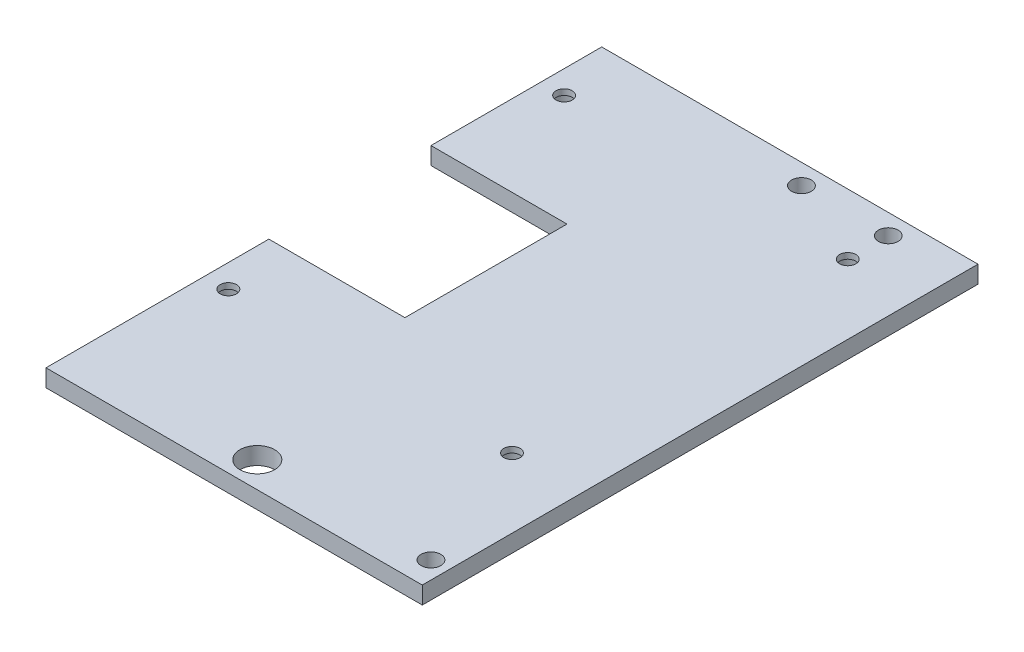
ISO-10303-21;
HEADER;
FILE_DESCRIPTION(('STEP AP214'),'2;1');
FILE_NAME('part.step','',(''),(''),'','','');
FILE_SCHEMA(('AUTOMOTIVE_DESIGN { 1 0 10303 214 1 1 1 1 }'));
ENDSEC;
DATA;
#1=APPLICATION_CONTEXT('core data for automotive mechanical design processes');
#2=APPLICATION_PROTOCOL_DEFINITION('international standard','automotive_design',2000,#1);
#3=PRODUCT_CONTEXT('',#1,'mechanical');
#4=PRODUCT('Part','Part','',(#3));
#5=PRODUCT_RELATED_PRODUCT_CATEGORY('part','',(#4));
#6=PRODUCT_DEFINITION_FORMATION('','',#4);
#7=PRODUCT_DEFINITION_CONTEXT('part definition',#1,'design');
#8=PRODUCT_DEFINITION('design','',#6,#7);
#9=PRODUCT_DEFINITION_SHAPE('','',#8);
#10=(LENGTH_UNIT() NAMED_UNIT(*) SI_UNIT(.MILLI.,.METRE.));
#11=(NAMED_UNIT(*) PLANE_ANGLE_UNIT() SI_UNIT($,.RADIAN.));
#12=(NAMED_UNIT(*) SI_UNIT($,.STERADIAN.) SOLID_ANGLE_UNIT());
#13=UNCERTAINTY_MEASURE_WITH_UNIT(LENGTH_MEASURE(1.E-05),#10,'distance_accuracy_value','');
#14=(GEOMETRIC_REPRESENTATION_CONTEXT(3) GLOBAL_UNCERTAINTY_ASSIGNED_CONTEXT((#13)) GLOBAL_UNIT_ASSIGNED_CONTEXT((#10,
#11,#12)) REPRESENTATION_CONTEXT('',''));
#15=CARTESIAN_POINT('',(0.,0.,0.));
#16=DIRECTION('',(0.,0.,1.));
#17=DIRECTION('',(1.,0.,0.));
#18=AXIS2_PLACEMENT_3D('',#15,#16,#17);
#19=CARTESIAN_POINT('',(7.49999999999999,3.,-37.5));
#20=DIRECTION('',(0.,-1.,0.));
#21=DIRECTION('',(0.,0.,-1.));
#22=AXIS2_PLACEMENT_3D('',#19,#20,#21);
#23=CYLINDRICAL_SURFACE('',#22,1.4);
#24=CARTESIAN_POINT('',(7.49999999999999,2.,-37.5));
#25=DIRECTION('',(0.,1.,0.));
#26=DIRECTION('',(0.,0.,1.));
#27=AXIS2_PLACEMENT_3D('',#24,#25,#26);
#28=CIRCLE('',#27,1.4);
#29=CARTESIAN_POINT('',(7.49999999999999,2.,-36.1));
#30=VERTEX_POINT('',#29);
#31=EDGE_CURVE('E299',#30,#30,#28,.T.);
#32=ORIENTED_EDGE('',*,*,#31,.F.);
#33=EDGE_LOOP('',(#32));
#34=FACE_BOUND('',#33,.T.);
#35=CARTESIAN_POINT('',(7.49999999999999,3.,-37.5));
#36=DIRECTION('',(0.,1.,0.));
#37=DIRECTION('',(0.,0.,1.));
#38=AXIS2_PLACEMENT_3D('',#35,#36,#37);
#39=CIRCLE('',#38,1.4);
#40=CARTESIAN_POINT('',(7.49999999999999,3.,-36.1));
#41=VERTEX_POINT('',#40);
#42=EDGE_CURVE('E211',#41,#41,#39,.T.);
#43=ORIENTED_EDGE('',*,*,#42,.T.);
#44=EDGE_LOOP('',(#43));
#45=FACE_BOUND('',#44,.T.);
#46=ADVANCED_FACE('F95',(#34,#45),#23,.F.);
#47=CARTESIAN_POINT('',(16.5,3.,43.5));
#48=DIRECTION('',(0.,-1.,0.));
#49=DIRECTION('',(0.,0.,-1.));
#50=AXIS2_PLACEMENT_3D('',#47,#48,#49);
#51=CYLINDRICAL_SURFACE('',#50,1.7);
#52=CARTESIAN_POINT('',(16.5,3.,43.5));
#53=DIRECTION('',(0.,1.,0.));
#54=DIRECTION('',(0.,0.,1.));
#55=AXIS2_PLACEMENT_3D('',#52,#53,#54);
#56=CIRCLE('',#55,1.7);
#57=CARTESIAN_POINT('',(16.5,3.,45.2));
#58=VERTEX_POINT('',#57);
#59=EDGE_CURVE('E208',#58,#58,#56,.T.);
#60=ORIENTED_EDGE('',*,*,#59,.T.);
#61=EDGE_LOOP('',(#60));
#62=FACE_BOUND('',#61,.T.);
#63=CARTESIAN_POINT('',(16.5,0.,43.5));
#64=DIRECTION('',(0.,1.,0.));
#65=DIRECTION('',(0.,0.,1.));
#66=AXIS2_PLACEMENT_3D('',#63,#64,#65);
#67=CIRCLE('',#66,1.7);
#68=CARTESIAN_POINT('',(16.5,0.,45.2));
#69=VERTEX_POINT('',#68);
#70=EDGE_CURVE('E239',#69,#69,#67,.T.);
#71=ORIENTED_EDGE('',*,*,#70,.F.);
#72=EDGE_LOOP('',(#71));
#73=FACE_BOUND('',#72,.T.);
#74=ADVANCED_FACE('F333',(#62,#73),#51,.F.);
#75=CARTESIAN_POINT('',(7.49999999999999,3.,-44.5));
#76=DIRECTION('',(0.,-1.,0.));
#77=DIRECTION('',(0.,0.,-1.));
#78=AXIS2_PLACEMENT_3D('',#75,#76,#77);
#79=CYLINDRICAL_SURFACE('',#78,1.70000000000001);
#80=CARTESIAN_POINT('',(7.49999999999999,3.,-44.5));
#81=DIRECTION('',(0.,1.,0.));
#82=DIRECTION('',(0.,0.,1.));
#83=AXIS2_PLACEMENT_3D('',#80,#81,#82);
#84=CIRCLE('',#83,1.70000000000001);
#85=CARTESIAN_POINT('',(7.49999999999999,3.,-42.8));
#86=VERTEX_POINT('',#85);
#87=EDGE_CURVE('E205',#86,#86,#84,.T.);
#88=ORIENTED_EDGE('',*,*,#87,.T.);
#89=EDGE_LOOP('',(#88));
#90=FACE_BOUND('',#89,.T.);
#91=CARTESIAN_POINT('',(7.49999999999999,0.,-44.5));
#92=DIRECTION('',(0.,1.,0.));
#93=DIRECTION('',(0.,0.,1.));
#94=AXIS2_PLACEMENT_3D('',#91,#92,#93);
#95=CIRCLE('',#94,1.70000000000001);
#96=CARTESIAN_POINT('',(7.49999999999999,0.,-42.8));
#97=VERTEX_POINT('',#96);
#98=EDGE_CURVE('E236',#97,#97,#95,.T.);
#99=ORIENTED_EDGE('',*,*,#98,.F.);
#100=EDGE_LOOP('',(#99));
#101=FACE_BOUND('',#100,.T.);
#102=ADVANCED_FACE('F339',(#90,#101),#79,.F.);
#103=CARTESIAN_POINT('',(-41.5,3.,-37.5));
#104=DIRECTION('',(0.,-1.,0.));
#105=DIRECTION('',(0.,0.,-1.));
#106=AXIS2_PLACEMENT_3D('',#103,#104,#105);
#107=CYLINDRICAL_SURFACE('',#106,1.4);
#108=CARTESIAN_POINT('',(-41.5,2.,-37.5));
#109=DIRECTION('',(0.,1.,0.));
#110=DIRECTION('',(0.,0.,1.));
#111=AXIS2_PLACEMENT_3D('',#108,#109,#110);
#112=CIRCLE('',#111,1.4);
#113=CARTESIAN_POINT('',(-41.5,2.,-36.1));
#114=VERTEX_POINT('',#113);
#115=EDGE_CURVE('E290',#114,#114,#112,.T.);
#116=ORIENTED_EDGE('',*,*,#115,.F.);
#117=EDGE_LOOP('',(#116));
#118=FACE_BOUND('',#117,.T.);
#119=CARTESIAN_POINT('',(-41.5,3.,-37.5));
#120=DIRECTION('',(0.,1.,0.));
#121=DIRECTION('',(0.,0.,1.));
#122=AXIS2_PLACEMENT_3D('',#119,#120,#121);
#123=CIRCLE('',#122,1.4);
#124=CARTESIAN_POINT('',(-41.5,3.,-36.1));
#125=VERTEX_POINT('',#124);
#126=EDGE_CURVE('E202',#125,#125,#123,.T.);
#127=ORIENTED_EDGE('',*,*,#126,.T.);
#128=EDGE_LOOP('',(#127));
#129=FACE_BOUND('',#128,.T.);
#130=ADVANCED_FACE('F347',(#118,#129),#107,.F.);
#131=CARTESIAN_POINT('',(-41.5,3.,20.5));
#132=DIRECTION('',(0.,-1.,0.));
#133=DIRECTION('',(0.,0.,-1.));
#134=AXIS2_PLACEMENT_3D('',#131,#132,#133);
#135=CYLINDRICAL_SURFACE('',#134,1.4);
#136=CARTESIAN_POINT('',(-41.5,2.,20.5));
#137=DIRECTION('',(0.,1.,0.));
#138=DIRECTION('',(0.,0.,1.));
#139=AXIS2_PLACEMENT_3D('',#136,#137,#138);
#140=CIRCLE('',#139,1.4);
#141=CARTESIAN_POINT('',(-41.5,2.,21.9));
#142=VERTEX_POINT('',#141);
#143=EDGE_CURVE('E280',#142,#142,#140,.T.);
#144=ORIENTED_EDGE('',*,*,#143,.F.);
#145=EDGE_LOOP('',(#144));
#146=FACE_BOUND('',#145,.T.);
#147=CARTESIAN_POINT('',(-41.5,3.,20.5));
#148=DIRECTION('',(0.,1.,0.));
#149=DIRECTION('',(0.,0.,1.));
#150=AXIS2_PLACEMENT_3D('',#147,#148,#149);
#151=CIRCLE('',#150,1.4);
#152=CARTESIAN_POINT('',(-41.5,3.,21.9));
#153=VERTEX_POINT('',#152);
#154=EDGE_CURVE('E199',#153,#153,#151,.T.);
#155=ORIENTED_EDGE('',*,*,#154,.T.);
#156=EDGE_LOOP('',(#155));
#157=FACE_BOUND('',#156,.T.);
#158=ADVANCED_FACE('F351',(#146,#157),#135,.F.);
#159=CARTESIAN_POINT('',(-7.50000000000001,3.,-44.5));
#160=DIRECTION('',(0.,-1.,0.));
#161=DIRECTION('',(0.,0.,-1.));
#162=AXIS2_PLACEMENT_3D('',#159,#160,#161);
#163=CYLINDRICAL_SURFACE('',#162,1.70000000000001);
#164=CARTESIAN_POINT('',(-7.50000000000001,3.,-44.5));
#165=DIRECTION('',(0.,1.,0.));
#166=DIRECTION('',(0.,0.,1.));
#167=AXIS2_PLACEMENT_3D('',#164,#165,#166);
#168=CIRCLE('',#167,1.70000000000001);
#169=CARTESIAN_POINT('',(-7.50000000000001,3.,-42.8));
#170=VERTEX_POINT('',#169);
#171=EDGE_CURVE('E196',#170,#170,#168,.T.);
#172=ORIENTED_EDGE('',*,*,#171,.T.);
#173=EDGE_LOOP('',(#172));
#174=FACE_BOUND('',#173,.T.);
#175=CARTESIAN_POINT('',(-7.50000000000001,0.,-44.5));
#176=DIRECTION('',(0.,1.,0.));
#177=DIRECTION('',(0.,0.,1.));
#178=AXIS2_PLACEMENT_3D('',#175,#176,#177);
#179=CIRCLE('',#178,1.70000000000001);
#180=CARTESIAN_POINT('',(-7.50000000000001,0.,-42.8));
#181=VERTEX_POINT('',#180);
#182=EDGE_CURVE('E233',#181,#181,#179,.T.);
#183=ORIENTED_EDGE('',*,*,#182,.F.);
#184=EDGE_LOOP('',(#183));
#185=FACE_BOUND('',#184,.T.);
#186=ADVANCED_FACE('F355',(#174,#185),#163,.F.);
#187=CARTESIAN_POINT('',(-13.5,3.,43.5));
#188=DIRECTION('',(0.,-1.,0.));
#189=DIRECTION('',(0.,0.,-1.));
#190=AXIS2_PLACEMENT_3D('',#187,#188,#189);
#191=CYLINDRICAL_SURFACE('',#190,3.);
#192=CARTESIAN_POINT('',(-13.5,3.,43.5));
#193=DIRECTION('',(0.,1.,0.));
#194=DIRECTION('',(0.,0.,1.));
#195=AXIS2_PLACEMENT_3D('',#192,#193,#194);
#196=CIRCLE('',#195,3.);
#197=CARTESIAN_POINT('',(-13.5,3.,46.5));
#198=VERTEX_POINT('',#197);
#199=EDGE_CURVE('E189',#198,#198,#196,.T.);
#200=ORIENTED_EDGE('',*,*,#199,.T.);
#201=EDGE_LOOP('',(#200));
#202=FACE_BOUND('',#201,.T.);
#203=CARTESIAN_POINT('',(-13.5,0.,43.5));
#204=DIRECTION('',(0.,1.,0.));
#205=DIRECTION('',(0.,0.,1.));
#206=AXIS2_PLACEMENT_3D('',#203,#204,#205);
#207=CIRCLE('',#206,3.);
#208=CARTESIAN_POINT('',(-13.5,0.,46.5));
#209=VERTEX_POINT('',#208);
#210=EDGE_CURVE('E230',#209,#209,#207,.T.);
#211=ORIENTED_EDGE('',*,*,#210,.F.);
#212=EDGE_LOOP('',(#211));
#213=FACE_BOUND('',#212,.T.);
#214=ADVANCED_FACE('F359',(#202,#213),#191,.F.);
#215=CARTESIAN_POINT('',(19.5,3.,0.));
#216=DIRECTION('',(1.,0.,0.));
#217=DIRECTION('',(0.,0.,-1.));
#218=AXIS2_PLACEMENT_3D('',#215,#216,#217);
#219=PLANE('',#218);
#220=DIRECTION('',(0.,0.,1.));
#221=VECTOR('',#220,1.);
#222=CARTESIAN_POINT('',(19.5,0.,0.));
#223=LINE('',#222,#221);
#224=CARTESIAN_POINT('',(19.5,0.,-48.));
#225=VERTEX_POINT('',#224);
#226=CARTESIAN_POINT('',(19.5,0.,48.));
#227=VERTEX_POINT('',#226);
#228=EDGE_CURVE('E218',#225,#227,#223,.T.);
#229=ORIENTED_EDGE('',*,*,#228,.F.);
#230=DIRECTION('',(0.,-1.,0.));
#231=VECTOR('',#230,1.);
#232=CARTESIAN_POINT('',(19.5,3.,-48.));
#233=LINE('',#232,#231);
#234=CARTESIAN_POINT('',(19.5,3.,-48.));
#235=VERTEX_POINT('',#234);
#236=EDGE_CURVE('E105',#235,#225,#233,.T.);
#237=ORIENTED_EDGE('',*,*,#236,.F.);
#238=DIRECTION('',(0.,0.,1.));
#239=VECTOR('',#238,1.);
#240=CARTESIAN_POINT('',(19.5,3.,0.));
#241=LINE('',#240,#239);
#242=CARTESIAN_POINT('',(19.5,3.,48.));
#243=VERTEX_POINT('',#242);
#244=EDGE_CURVE('E274',#235,#243,#241,.T.);
#245=ORIENTED_EDGE('',*,*,#244,.T.);
#246=DIRECTION('',(0.,-1.,0.));
#247=VECTOR('',#246,1.);
#248=CARTESIAN_POINT('',(19.5,3.,48.));
#249=LINE('',#248,#247);
#250=EDGE_CURVE('E12',#243,#227,#249,.T.);
#251=ORIENTED_EDGE('',*,*,#250,.T.);
#252=EDGE_LOOP('',(#229,#237,#245,#251));
#253=FACE_BOUND('',#252,.T.);
#254=ADVANCED_FACE('F259',(#253),#219,.T.);
#255=CARTESIAN_POINT('',(0.,3.,-48.));
#256=DIRECTION('',(0.,0.,-1.));
#257=DIRECTION('',(-1.,0.,0.));
#258=AXIS2_PLACEMENT_3D('',#255,#256,#257);
#259=PLANE('',#258);
#260=DIRECTION('',(1.,0.,0.));
#261=VECTOR('',#260,1.);
#262=CARTESIAN_POINT('',(0.,0.,-48.));
#263=LINE('',#262,#261);
#264=CARTESIAN_POINT('',(-45.5,0.,-48.));
#265=VERTEX_POINT('',#264);
#266=EDGE_CURVE('E221',#265,#225,#263,.T.);
#267=ORIENTED_EDGE('',*,*,#266,.F.);
#268=DIRECTION('',(0.,-1.,0.));
#269=VECTOR('',#268,1.);
#270=CARTESIAN_POINT('',(-45.5,3.,-48.));
#271=LINE('',#270,#269);
#272=CARTESIAN_POINT('',(-45.5,3.,-48.));
#273=VERTEX_POINT('',#272);
#274=EDGE_CURVE('E248',#273,#265,#271,.T.);
#275=ORIENTED_EDGE('',*,*,#274,.F.);
#276=DIRECTION('',(1.,0.,0.));
#277=VECTOR('',#276,1.);
#278=CARTESIAN_POINT('',(0.,3.,-48.));
#279=LINE('',#278,#277);
#280=EDGE_CURVE('E256',#273,#235,#279,.T.);
#281=ORIENTED_EDGE('',*,*,#280,.T.);
#282=ORIENTED_EDGE('',*,*,#236,.T.);
#283=EDGE_LOOP('',(#267,#275,#281,#282));
#284=FACE_BOUND('',#283,.T.);
#285=ADVANCED_FACE('F254',(#284),#259,.T.);
#286=CARTESIAN_POINT('',(-45.5,3.,0.));
#287=DIRECTION('',(1.,0.,0.));
#288=DIRECTION('',(0.,0.,-1.));
#289=AXIS2_PLACEMENT_3D('',#286,#287,#288);
#290=PLANE('',#289);
#291=DIRECTION('',(0.,0.,1.));
#292=VECTOR('',#291,1.);
#293=CARTESIAN_POINT('',(-45.5,0.,0.));
#294=LINE('',#293,#292);
#295=CARTESIAN_POINT('',(-45.5,0.,-18.5));
#296=VERTEX_POINT('',#295);
#297=EDGE_CURVE('E224',#265,#296,#294,.T.);
#298=ORIENTED_EDGE('',*,*,#297,.T.);
#299=DIRECTION('',(0.,-1.,0.));
#300=VECTOR('',#299,1.);
#301=CARTESIAN_POINT('',(-45.5,3.,-18.5));
#302=LINE('',#301,#300);
#303=CARTESIAN_POINT('',(-45.5,3.,-18.5));
#304=VERTEX_POINT('',#303);
#305=EDGE_CURVE('E245',#304,#296,#302,.T.);
#306=ORIENTED_EDGE('',*,*,#305,.F.);
#307=DIRECTION('',(0.,0.,1.));
#308=VECTOR('',#307,1.);
#309=CARTESIAN_POINT('',(-45.5,3.,0.));
#310=LINE('',#309,#308);
#311=EDGE_CURVE('E191',#273,#304,#310,.T.);
#312=ORIENTED_EDGE('',*,*,#311,.F.);
#313=ORIENTED_EDGE('',*,*,#274,.T.);
#314=EDGE_LOOP('',(#298,#306,#312,#313));
#315=FACE_BOUND('',#314,.T.);
#316=ADVANCED_FACE('F268',(#315),#290,.F.);
#317=CARTESIAN_POINT('',(0.,3.,-18.5));
#318=DIRECTION('',(0.,0.,-1.));
#319=DIRECTION('',(-1.,0.,0.));
#320=AXIS2_PLACEMENT_3D('',#317,#318,#319);
#321=PLANE('',#320);
#322=DIRECTION('',(1.,0.,0.));
#323=VECTOR('',#322,1.);
#324=CARTESIAN_POINT('',(0.,0.,-18.5));
#325=LINE('',#324,#323);
#326=CARTESIAN_POINT('',(-22.,0.,-18.5));
#327=VERTEX_POINT('',#326);
#328=EDGE_CURVE('E226',#296,#327,#325,.T.);
#329=ORIENTED_EDGE('',*,*,#328,.T.);
#330=DIRECTION('',(0.,-1.,0.));
#331=VECTOR('',#330,1.);
#332=CARTESIAN_POINT('',(-22.,3.,-18.5));
#333=LINE('',#332,#331);
#334=CARTESIAN_POINT('',(-22.,3.,-18.5));
#335=VERTEX_POINT('',#334);
#336=EDGE_CURVE('E184',#335,#327,#333,.T.);
#337=ORIENTED_EDGE('',*,*,#336,.F.);
#338=DIRECTION('',(1.,0.,0.));
#339=VECTOR('',#338,1.);
#340=CARTESIAN_POINT('',(0.,3.,-18.5));
#341=LINE('',#340,#339);
#342=EDGE_CURVE('E175',#304,#335,#341,.T.);
#343=ORIENTED_EDGE('',*,*,#342,.F.);
#344=ORIENTED_EDGE('',*,*,#305,.T.);
#345=EDGE_LOOP('',(#329,#337,#343,#344));
#346=FACE_BOUND('',#345,.T.);
#347=ADVANCED_FACE('F271',(#346),#321,.F.);
#348=CARTESIAN_POINT('',(-22.,3.,0.));
#349=DIRECTION('',(1.,0.,0.));
#350=DIRECTION('',(0.,0.,-1.));
#351=AXIS2_PLACEMENT_3D('',#348,#349,#350);
#352=PLANE('',#351);
#353=DIRECTION('',(0.,0.,1.));
#354=VECTOR('',#353,1.);
#355=CARTESIAN_POINT('',(-22.,0.,0.));
#356=LINE('',#355,#354);
#357=CARTESIAN_POINT('',(-22.,0.,9.50000000000004));
#358=VERTEX_POINT('',#357);
#359=EDGE_CURVE('E183',#327,#358,#356,.T.);
#360=ORIENTED_EDGE('',*,*,#359,.T.);
#361=DIRECTION('',(0.,-1.,0.));
#362=VECTOR('',#361,1.);
#363=CARTESIAN_POINT('',(-22.,3.,9.50000000000004));
#364=LINE('',#363,#362);
#365=CARTESIAN_POINT('',(-22.,3.,9.50000000000004));
#366=VERTEX_POINT('',#365);
#367=EDGE_CURVE('E180',#366,#358,#364,.T.);
#368=ORIENTED_EDGE('',*,*,#367,.F.);
#369=DIRECTION('',(0.,0.,1.));
#370=VECTOR('',#369,1.);
#371=CARTESIAN_POINT('',(-22.,3.,0.));
#372=LINE('',#371,#370);
#373=EDGE_CURVE('E168',#335,#366,#372,.T.);
#374=ORIENTED_EDGE('',*,*,#373,.F.);
#375=ORIENTED_EDGE('',*,*,#336,.T.);
#376=EDGE_LOOP('',(#360,#368,#374,#375));
#377=FACE_BOUND('',#376,.T.);
#378=ADVANCED_FACE('F181',(#377),#352,.F.);
#379=CARTESIAN_POINT('',(0.,3.,9.50000000000003));
#380=DIRECTION('',(0.,0.,1.));
#381=DIRECTION('',(1.,0.,0.));
#382=AXIS2_PLACEMENT_3D('',#379,#380,#381);
#383=PLANE('',#382);
#384=DIRECTION('',(-1.,0.,0.));
#385=VECTOR('',#384,1.);
#386=CARTESIAN_POINT('',(0.,0.,9.50000000000003));
#387=LINE('',#386,#385);
#388=CARTESIAN_POINT('',(-45.5,0.,9.50000000000004));
#389=VERTEX_POINT('',#388);
#390=EDGE_CURVE('E141',#358,#389,#387,.T.);
#391=ORIENTED_EDGE('',*,*,#390,.T.);
#392=DIRECTION('',(0.,-1.,0.));
#393=VECTOR('',#392,1.);
#394=CARTESIAN_POINT('',(-45.5,3.,9.50000000000004));
#395=LINE('',#394,#393);
#396=CARTESIAN_POINT('',(-45.5,3.,9.50000000000004));
#397=VERTEX_POINT('',#396);
#398=EDGE_CURVE('E185',#397,#389,#395,.T.);
#399=ORIENTED_EDGE('',*,*,#398,.F.);
#400=DIRECTION('',(-1.,0.,0.));
#401=VECTOR('',#400,1.);
#402=CARTESIAN_POINT('',(0.,3.,9.50000000000003));
#403=LINE('',#402,#401);
#404=EDGE_CURVE('E173',#366,#397,#403,.T.);
#405=ORIENTED_EDGE('',*,*,#404,.F.);
#406=ORIENTED_EDGE('',*,*,#367,.T.);
#407=EDGE_LOOP('',(#391,#399,#405,#406));
#408=FACE_BOUND('',#407,.T.);
#409=ADVANCED_FACE('F187',(#408),#383,.F.);
#410=CARTESIAN_POINT('',(-45.5000000000001,0.,48.));
#411=VERTEX_POINT('',#410);
#412=EDGE_CURVE('E147',#389,#411,#294,.T.);
#413=ORIENTED_EDGE('',*,*,#412,.T.);
#414=DIRECTION('',(0.,-1.,0.));
#415=VECTOR('',#414,1.);
#416=CARTESIAN_POINT('',(-45.5000000000001,3.,48.));
#417=LINE('',#416,#415);
#418=CARTESIAN_POINT('',(-45.5000000000001,3.,48.));
#419=VERTEX_POINT('',#418);
#420=EDGE_CURVE('E214',#419,#411,#417,.T.);
#421=ORIENTED_EDGE('',*,*,#420,.F.);
#422=EDGE_CURVE('E113',#397,#419,#310,.T.);
#423=ORIENTED_EDGE('',*,*,#422,.F.);
#424=ORIENTED_EDGE('',*,*,#398,.T.);
#425=EDGE_LOOP('',(#413,#421,#423,#424));
#426=FACE_BOUND('',#425,.T.);
#427=ADVANCED_FACE('F364',(#426),#290,.F.);
#428=CARTESIAN_POINT('',(0.,3.,48.));
#429=DIRECTION('',(0.,0.,-1.));
#430=DIRECTION('',(-1.,0.,0.));
#431=AXIS2_PLACEMENT_3D('',#428,#429,#430);
#432=PLANE('',#431);
#433=DIRECTION('',(1.,0.,0.));
#434=VECTOR('',#433,1.);
#435=CARTESIAN_POINT('',(0.,0.,48.));
#436=LINE('',#435,#434);
#437=EDGE_CURVE('E215',#411,#227,#436,.T.);
#438=ORIENTED_EDGE('',*,*,#437,.T.);
#439=ORIENTED_EDGE('',*,*,#250,.F.);
#440=DIRECTION('',(1.,0.,0.));
#441=VECTOR('',#440,1.);
#442=CARTESIAN_POINT('',(0.,3.,48.));
#443=LINE('',#442,#441);
#444=EDGE_CURVE('E153',#419,#243,#443,.T.);
#445=ORIENTED_EDGE('',*,*,#444,.F.);
#446=ORIENTED_EDGE('',*,*,#420,.T.);
#447=EDGE_LOOP('',(#438,#439,#445,#446));
#448=FACE_BOUND('',#447,.T.);
#449=ADVANCED_FACE('F328',(#448),#432,.F.);
#450=CARTESIAN_POINT('',(0.,0.,0.));
#451=DIRECTION('',(0.,1.,0.));
#452=DIRECTION('',(0.,0.,1.));
#453=AXIS2_PLACEMENT_3D('',#450,#451,#452);
#454=PLANE('',#453);
#455=CARTESIAN_POINT('',(-41.5,0.,-37.5));
#456=DIRECTION('',(0.,1.,0.));
#457=DIRECTION('',(0.,0.,1.));
#458=AXIS2_PLACEMENT_3D('',#455,#456,#457);
#459=CIRCLE('',#458,2.4);
#460=CARTESIAN_POINT('',(-41.5,0.,-35.1));
#461=VERTEX_POINT('',#460);
#462=EDGE_CURVE('E287',#461,#461,#459,.T.);
#463=ORIENTED_EDGE('',*,*,#462,.T.);
#464=EDGE_LOOP('',(#463));
#465=FACE_BOUND('',#464,.T.);
#466=CARTESIAN_POINT('',(7.49999999999999,0.,-37.5));
#467=DIRECTION('',(0.,1.,0.));
#468=DIRECTION('',(0.,0.,1.));
#469=AXIS2_PLACEMENT_3D('',#466,#467,#468);
#470=CIRCLE('',#469,2.4);
#471=CARTESIAN_POINT('',(7.49999999999999,0.,-35.1));
#472=VERTEX_POINT('',#471);
#473=EDGE_CURVE('E294',#472,#472,#470,.T.);
#474=ORIENTED_EDGE('',*,*,#473,.T.);
#475=EDGE_LOOP('',(#474));
#476=FACE_BOUND('',#475,.T.);
#477=CARTESIAN_POINT('',(7.49999999999999,0.,20.5));
#478=DIRECTION('',(0.,1.,0.));
#479=DIRECTION('',(0.,0.,1.));
#480=AXIS2_PLACEMENT_3D('',#477,#478,#479);
#481=CIRCLE('',#480,2.4);
#482=CARTESIAN_POINT('',(7.49999999999999,0.,22.9));
#483=VERTEX_POINT('',#482);
#484=EDGE_CURVE('E303',#483,#483,#481,.T.);
#485=ORIENTED_EDGE('',*,*,#484,.T.);
#486=EDGE_LOOP('',(#485));
#487=FACE_BOUND('',#486,.T.);
#488=CARTESIAN_POINT('',(-41.5,0.,20.5));
#489=DIRECTION('',(0.,1.,0.));
#490=DIRECTION('',(0.,0.,1.));
#491=AXIS2_PLACEMENT_3D('',#488,#489,#490);
#492=CIRCLE('',#491,2.4);
#493=CARTESIAN_POINT('',(-41.5,0.,22.9));
#494=VERTEX_POINT('',#493);
#495=EDGE_CURVE('E277',#494,#494,#492,.T.);
#496=ORIENTED_EDGE('',*,*,#495,.T.);
#497=EDGE_LOOP('',(#496));
#498=FACE_BOUND('',#497,.T.);
#499=ORIENTED_EDGE('',*,*,#437,.F.);
#500=ORIENTED_EDGE('',*,*,#412,.F.);
#501=ORIENTED_EDGE('',*,*,#390,.F.);
#502=ORIENTED_EDGE('',*,*,#359,.F.);
#503=ORIENTED_EDGE('',*,*,#328,.F.);
#504=ORIENTED_EDGE('',*,*,#297,.F.);
#505=ORIENTED_EDGE('',*,*,#266,.T.);
#506=ORIENTED_EDGE('',*,*,#228,.T.);
#507=EDGE_LOOP('',(#499,#500,#501,#502,#503,#504,#505,#506));
#508=FACE_BOUND('',#507,.T.);
#509=ORIENTED_EDGE('',*,*,#210,.T.);
#510=EDGE_LOOP('',(#509));
#511=FACE_BOUND('',#510,.T.);
#512=ORIENTED_EDGE('',*,*,#182,.T.);
#513=EDGE_LOOP('',(#512));
#514=FACE_BOUND('',#513,.T.);
#515=ORIENTED_EDGE('',*,*,#98,.T.);
#516=EDGE_LOOP('',(#515));
#517=FACE_BOUND('',#516,.T.);
#518=ORIENTED_EDGE('',*,*,#70,.T.);
#519=EDGE_LOOP('',(#518));
#520=FACE_BOUND('',#519,.T.);
#521=ADVANCED_FACE('F263',(#465,#476,#487,#498,#508,#511,#514,#517,#520),#454,.F.);
#522=CARTESIAN_POINT('',(0.,3.,0.));
#523=DIRECTION('',(0.,1.,0.));
#524=DIRECTION('',(0.,0.,1.));
#525=AXIS2_PLACEMENT_3D('',#522,#523,#524);
#526=PLANE('',#525);
#527=ORIENTED_EDGE('',*,*,#444,.T.);
#528=ORIENTED_EDGE('',*,*,#244,.F.);
#529=ORIENTED_EDGE('',*,*,#280,.F.);
#530=ORIENTED_EDGE('',*,*,#311,.T.);
#531=ORIENTED_EDGE('',*,*,#342,.T.);
#532=ORIENTED_EDGE('',*,*,#373,.T.);
#533=ORIENTED_EDGE('',*,*,#404,.T.);
#534=ORIENTED_EDGE('',*,*,#422,.T.);
#535=EDGE_LOOP('',(#527,#528,#529,#530,#531,#532,#533,#534));
#536=FACE_BOUND('',#535,.T.);
#537=ORIENTED_EDGE('',*,*,#199,.F.);
#538=EDGE_LOOP('',(#537));
#539=FACE_BOUND('',#538,.T.);
#540=ORIENTED_EDGE('',*,*,#171,.F.);
#541=EDGE_LOOP('',(#540));
#542=FACE_BOUND('',#541,.T.);
#543=ORIENTED_EDGE('',*,*,#154,.F.);
#544=EDGE_LOOP('',(#543));
#545=FACE_BOUND('',#544,.T.);
#546=ORIENTED_EDGE('',*,*,#126,.F.);
#547=EDGE_LOOP('',(#546));
#548=FACE_BOUND('',#547,.T.);
#549=ORIENTED_EDGE('',*,*,#87,.F.);
#550=EDGE_LOOP('',(#549));
#551=FACE_BOUND('',#550,.T.);
#552=ORIENTED_EDGE('',*,*,#59,.F.);
#553=EDGE_LOOP('',(#552));
#554=FACE_BOUND('',#553,.T.);
#555=ORIENTED_EDGE('',*,*,#42,.F.);
#556=EDGE_LOOP('',(#555));
#557=FACE_BOUND('',#556,.T.);
#558=CARTESIAN_POINT('',(7.49999999999999,3.,20.5));
#559=DIRECTION('',(0.,1.,0.));
#560=DIRECTION('',(0.,0.,1.));
#561=AXIS2_PLACEMENT_3D('',#558,#559,#560);
#562=CIRCLE('',#561,1.4);
#563=CARTESIAN_POINT('',(7.49999999999999,3.,21.9));
#564=VERTEX_POINT('',#563);
#565=EDGE_CURVE('E99',#564,#564,#562,.T.);
#566=ORIENTED_EDGE('',*,*,#565,.F.);
#567=EDGE_LOOP('',(#566));
#568=FACE_BOUND('',#567,.T.);
#569=ADVANCED_FACE('F170',(#536,#539,#542,#545,#548,#551,#554,#557,#568),#526,.T.);
#570=CARTESIAN_POINT('',(7.49999999999999,3.,20.5));
#571=DIRECTION('',(0.,-1.,0.));
#572=DIRECTION('',(0.,0.,-1.));
#573=AXIS2_PLACEMENT_3D('',#570,#571,#572);
#574=CYLINDRICAL_SURFACE('',#573,1.4);
#575=CARTESIAN_POINT('',(7.49999999999999,2.,20.5));
#576=DIRECTION('',(0.,1.,0.));
#577=DIRECTION('',(0.,0.,1.));
#578=AXIS2_PLACEMENT_3D('',#575,#576,#577);
#579=CIRCLE('',#578,1.4);
#580=CARTESIAN_POINT('',(7.49999999999999,2.,21.9));
#581=VERTEX_POINT('',#580);
#582=EDGE_CURVE('E308',#581,#581,#579,.T.);
#583=ORIENTED_EDGE('',*,*,#582,.F.);
#584=EDGE_LOOP('',(#583));
#585=FACE_BOUND('',#584,.T.);
#586=ORIENTED_EDGE('',*,*,#565,.T.);
#587=EDGE_LOOP('',(#586));
#588=FACE_BOUND('',#587,.T.);
#589=ADVANCED_FACE('F97',(#585,#588),#574,.F.);
#590=CARTESIAN_POINT('',(7.49999999999999,2.,20.5));
#591=DIRECTION('',(0.,-1.,0.));
#592=DIRECTION('',(0.,0.,-1.));
#593=AXIS2_PLACEMENT_3D('',#590,#591,#592);
#594=CYLINDRICAL_SURFACE('',#593,2.4);
#595=CARTESIAN_POINT('',(7.49999999999999,2.,20.5));
#596=DIRECTION('',(0.,1.,0.));
#597=DIRECTION('',(0.,0.,1.));
#598=AXIS2_PLACEMENT_3D('',#595,#596,#597);
#599=CIRCLE('',#598,2.4);
#600=CARTESIAN_POINT('',(7.49999999999999,2.,22.9));
#601=VERTEX_POINT('',#600);
#602=EDGE_CURVE('E281',#601,#601,#599,.T.);
#603=ORIENTED_EDGE('',*,*,#602,.T.);
#604=EDGE_LOOP('',(#603));
#605=FACE_BOUND('',#604,.T.);
#606=ORIENTED_EDGE('',*,*,#484,.F.);
#607=EDGE_LOOP('',(#606));
#608=FACE_BOUND('',#607,.T.);
#609=ADVANCED_FACE('F319',(#605,#608),#594,.F.);
#610=CARTESIAN_POINT('',(0.,2.,0.));
#611=DIRECTION('',(0.,1.,0.));
#612=DIRECTION('',(0.,0.,1.));
#613=AXIS2_PLACEMENT_3D('',#610,#611,#612);
#614=PLANE('',#613);
#615=ORIENTED_EDGE('',*,*,#582,.T.);
#616=EDGE_LOOP('',(#615));
#617=FACE_BOUND('',#616,.T.);
#618=ORIENTED_EDGE('',*,*,#602,.F.);
#619=EDGE_LOOP('',(#618));
#620=FACE_BOUND('',#619,.T.);
#621=ADVANCED_FACE('F314',(#617,#620),#614,.F.);
#622=CARTESIAN_POINT('',(-41.5,2.,20.5));
#623=DIRECTION('',(0.,-1.,0.));
#624=DIRECTION('',(0.,0.,-1.));
#625=AXIS2_PLACEMENT_3D('',#622,#623,#624);
#626=CYLINDRICAL_SURFACE('',#625,2.4);
#627=CARTESIAN_POINT('',(-41.5,2.,20.5));
#628=DIRECTION('',(0.,1.,0.));
#629=DIRECTION('',(0.,0.,1.));
#630=AXIS2_PLACEMENT_3D('',#627,#628,#629);
#631=CIRCLE('',#630,2.4);
#632=CARTESIAN_POINT('',(-41.5,2.,22.9));
#633=VERTEX_POINT('',#632);
#634=EDGE_CURVE('E282',#633,#633,#631,.T.);
#635=ORIENTED_EDGE('',*,*,#634,.T.);
#636=EDGE_LOOP('',(#635));
#637=FACE_BOUND('',#636,.T.);
#638=ORIENTED_EDGE('',*,*,#495,.F.);
#639=EDGE_LOOP('',(#638));
#640=FACE_BOUND('',#639,.T.);
#641=ADVANCED_FACE('F417',(#637,#640),#626,.F.);
#642=CARTESIAN_POINT('',(0.,2.,0.));
#643=DIRECTION('',(0.,1.,0.));
#644=DIRECTION('',(0.,0.,1.));
#645=AXIS2_PLACEMENT_3D('',#642,#643,#644);
#646=PLANE('',#645);
#647=ORIENTED_EDGE('',*,*,#143,.T.);
#648=EDGE_LOOP('',(#647));
#649=FACE_BOUND('',#648,.T.);
#650=ORIENTED_EDGE('',*,*,#634,.F.);
#651=EDGE_LOOP('',(#650));
#652=FACE_BOUND('',#651,.T.);
#653=ADVANCED_FACE('F426',(#649,#652),#646,.F.);
#654=CARTESIAN_POINT('',(7.49999999999999,2.,-37.5));
#655=DIRECTION('',(0.,-1.,0.));
#656=DIRECTION('',(0.,0.,-1.));
#657=AXIS2_PLACEMENT_3D('',#654,#655,#656);
#658=CYLINDRICAL_SURFACE('',#657,2.4);
#659=CARTESIAN_POINT('',(7.49999999999999,2.,-37.5));
#660=DIRECTION('',(0.,1.,0.));
#661=DIRECTION('',(0.,0.,1.));
#662=AXIS2_PLACEMENT_3D('',#659,#660,#661);
#663=CIRCLE('',#662,2.4);
#664=CARTESIAN_POINT('',(7.49999999999999,2.,-35.1));
#665=VERTEX_POINT('',#664);
#666=EDGE_CURVE('E300',#665,#665,#663,.T.);
#667=ORIENTED_EDGE('',*,*,#666,.T.);
#668=EDGE_LOOP('',(#667));
#669=FACE_BOUND('',#668,.T.);
#670=ORIENTED_EDGE('',*,*,#473,.F.);
#671=EDGE_LOOP('',(#670));
#672=FACE_BOUND('',#671,.T.);
#673=ADVANCED_FACE('F435',(#669,#672),#658,.F.);
#674=CARTESIAN_POINT('',(0.,2.,0.));
#675=DIRECTION('',(0.,1.,0.));
#676=DIRECTION('',(0.,0.,1.));
#677=AXIS2_PLACEMENT_3D('',#674,#675,#676);
#678=PLANE('',#677);
#679=ORIENTED_EDGE('',*,*,#31,.T.);
#680=EDGE_LOOP('',(#679));
#681=FACE_BOUND('',#680,.T.);
#682=ORIENTED_EDGE('',*,*,#666,.F.);
#683=EDGE_LOOP('',(#682));
#684=FACE_BOUND('',#683,.T.);
#685=ADVANCED_FACE('F445',(#681,#684),#678,.F.);
#686=CARTESIAN_POINT('',(-41.5,2.,-37.5));
#687=DIRECTION('',(0.,-1.,0.));
#688=DIRECTION('',(0.,0.,-1.));
#689=AXIS2_PLACEMENT_3D('',#686,#687,#688);
#690=CYLINDRICAL_SURFACE('',#689,2.4);
#691=CARTESIAN_POINT('',(-41.5,2.,-37.5));
#692=DIRECTION('',(0.,1.,0.));
#693=DIRECTION('',(0.,0.,1.));
#694=AXIS2_PLACEMENT_3D('',#691,#692,#693);
#695=CIRCLE('',#694,2.4);
#696=CARTESIAN_POINT('',(-41.5,2.,-35.1));
#697=VERTEX_POINT('',#696);
#698=EDGE_CURVE('E291',#697,#697,#695,.T.);
#699=ORIENTED_EDGE('',*,*,#698,.T.);
#700=EDGE_LOOP('',(#699));
#701=FACE_BOUND('',#700,.T.);
#702=ORIENTED_EDGE('',*,*,#462,.F.);
#703=EDGE_LOOP('',(#702));
#704=FACE_BOUND('',#703,.T.);
#705=ADVANCED_FACE('F455',(#701,#704),#690,.F.);
#706=CARTESIAN_POINT('',(0.,2.,0.));
#707=DIRECTION('',(0.,1.,0.));
#708=DIRECTION('',(0.,0.,1.));
#709=AXIS2_PLACEMENT_3D('',#706,#707,#708);
#710=PLANE('',#709);
#711=ORIENTED_EDGE('',*,*,#115,.T.);
#712=EDGE_LOOP('',(#711));
#713=FACE_BOUND('',#712,.T.);
#714=ORIENTED_EDGE('',*,*,#698,.F.);
#715=EDGE_LOOP('',(#714));
#716=FACE_BOUND('',#715,.T.);
#717=ADVANCED_FACE('F465',(#713,#716),#710,.F.);
#718=CLOSED_SHELL('',(#46,#74,#102,#130,#158,#186,#214,#254,#285,#316,#347,#378,#409,#427,#449,
#521,#569,#589,#609,#621,#641,#653,#673,#685,#705,#717));
#719=MANIFOLD_SOLID_BREP('B2',#718);
#720=ADVANCED_BREP_SHAPE_REPRESENTATION('',(#18,#719),#14);
#721=SHAPE_DEFINITION_REPRESENTATION(#9,#720);
ENDSEC;
END-ISO-10303-21;
